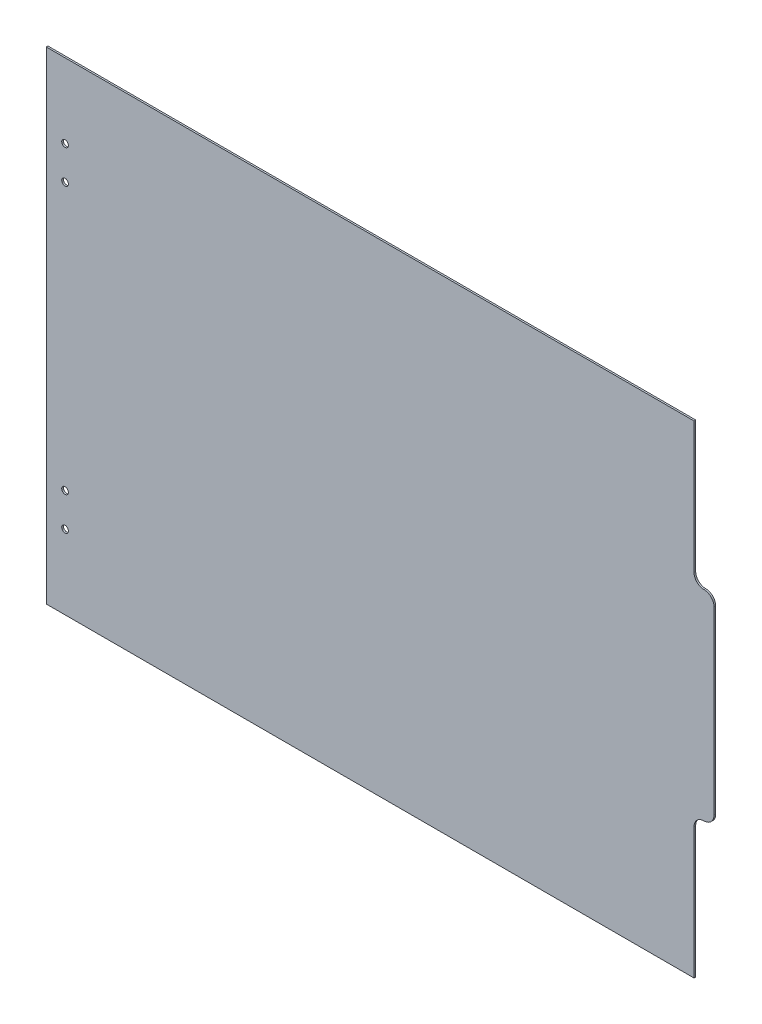
ISO-10303-21;
HEADER;
FILE_DESCRIPTION(('STEP AP214'),'2;1');
FILE_NAME('part.step','',(''),(''),'','','');
FILE_SCHEMA(('AUTOMOTIVE_DESIGN { 1 0 10303 214 1 1 1 1 }'));
ENDSEC;
DATA;
#1=APPLICATION_CONTEXT('core data for automotive mechanical design processes');
#2=APPLICATION_PROTOCOL_DEFINITION('international standard','automotive_design',2000,#1);
#3=PRODUCT_CONTEXT('',#1,'mechanical');
#4=PRODUCT('Part','Part','',(#3));
#5=PRODUCT_RELATED_PRODUCT_CATEGORY('part','',(#4));
#6=PRODUCT_DEFINITION_FORMATION('','',#4);
#7=PRODUCT_DEFINITION_CONTEXT('part definition',#1,'design');
#8=PRODUCT_DEFINITION('design','',#6,#7);
#9=PRODUCT_DEFINITION_SHAPE('','',#8);
#10=(LENGTH_UNIT() NAMED_UNIT(*) SI_UNIT(.MILLI.,.METRE.));
#11=(NAMED_UNIT(*) PLANE_ANGLE_UNIT() SI_UNIT($,.RADIAN.));
#12=(NAMED_UNIT(*) SI_UNIT($,.STERADIAN.) SOLID_ANGLE_UNIT());
#13=UNCERTAINTY_MEASURE_WITH_UNIT(LENGTH_MEASURE(1.E-05),#10,'distance_accuracy_value','');
#14=(GEOMETRIC_REPRESENTATION_CONTEXT(3) GLOBAL_UNCERTAINTY_ASSIGNED_CONTEXT((#13)) GLOBAL_UNIT_ASSIGNED_CONTEXT((#10,
#11,#12)) REPRESENTATION_CONTEXT('',''));
#15=CARTESIAN_POINT('',(0.,0.,0.));
#16=DIRECTION('',(0.,0.,1.));
#17=DIRECTION('',(1.,0.,0.));
#18=AXIS2_PLACEMENT_3D('',#15,#16,#17);
#19=CARTESIAN_POINT('',(194.,-144.5,1.));
#20=DIRECTION('',(-1.,0.,0.));
#21=DIRECTION('',(0.,0.,1.));
#22=AXIS2_PLACEMENT_3D('',#19,#20,#21);
#23=PLANE('',#22);
#24=DIRECTION('',(0.,1.,0.));
#25=VECTOR('',#24,1.);
#26=CARTESIAN_POINT('',(194.,-144.5,1.));
#27=LINE('',#26,#25);
#28=CARTESIAN_POINT('',(194.,66.,1.));
#29=VERTEX_POINT('',#28);
#30=CARTESIAN_POINT('',(194.,144.5,1.));
#31=VERTEX_POINT('',#30);
#32=EDGE_CURVE('E127',#29,#31,#27,.T.);
#33=ORIENTED_EDGE('',*,*,#32,.F.);
#34=DIRECTION('',(0.,0.,1.));
#35=VECTOR('',#34,1.);
#36=CARTESIAN_POINT('',(194.,66.,1.));
#37=LINE('',#36,#35);
#38=CARTESIAN_POINT('',(194.,66.,0.));
#39=VERTEX_POINT('',#38);
#40=EDGE_CURVE('E165',#29,#39,#37,.F.);
#41=ORIENTED_EDGE('',*,*,#40,.T.);
#42=DIRECTION('',(0.,1.,0.));
#43=VECTOR('',#42,1.);
#44=CARTESIAN_POINT('',(194.,-144.5,0.));
#45=LINE('',#44,#43);
#46=CARTESIAN_POINT('',(194.,144.5,0.));
#47=VERTEX_POINT('',#46);
#48=EDGE_CURVE('E196',#39,#47,#45,.T.);
#49=ORIENTED_EDGE('',*,*,#48,.T.);
#50=DIRECTION('',(0.,0.,-1.));
#51=VECTOR('',#50,1.);
#52=CARTESIAN_POINT('',(194.,144.5,1.));
#53=LINE('',#52,#51);
#54=EDGE_CURVE('E148',#31,#47,#53,.T.);
#55=ORIENTED_EDGE('',*,*,#54,.F.);
#56=EDGE_LOOP('',(#33,#41,#49,#55));
#57=FACE_BOUND('',#56,.T.);
#58=ADVANCED_FACE('F39',(#57),#23,.F.);
#59=CARTESIAN_POINT('',(0.,0.,1.));
#60=DIRECTION('',(0.,0.,1.));
#61=DIRECTION('',(1.,0.,0.));
#62=AXIS2_PLACEMENT_3D('',#59,#60,#61);
#63=PLANE('',#62);
#64=CARTESIAN_POINT('',(-182.759742868737,100.000000001524,1.));
#65=DIRECTION('',(0.,0.,1.));
#66=DIRECTION('',(1.,0.,0.));
#67=AXIS2_PLACEMENT_3D('',#64,#65,#66);
#68=CIRCLE('',#67,2.);
#69=CARTESIAN_POINT('',(-180.759742868737,100.000000001524,1.));
#70=VERTEX_POINT('',#69);
#71=EDGE_CURVE('E229',#70,#70,#68,.T.);
#72=ORIENTED_EDGE('',*,*,#71,.F.);
#73=EDGE_LOOP('',(#72));
#74=FACE_BOUND('',#73,.T.);
#75=CARTESIAN_POINT('',(-182.75974286874,-99.9999999999501,1.));
#76=DIRECTION('',(0.,0.,1.));
#77=DIRECTION('',(1.,0.,0.));
#78=AXIS2_PLACEMENT_3D('',#75,#76,#77);
#79=CIRCLE('',#78,1.99999999998629);
#80=CARTESIAN_POINT('',(-180.759742868754,-99.9999999999501,1.));
#81=VERTEX_POINT('',#80);
#82=EDGE_CURVE('E199',#81,#81,#79,.T.);
#83=ORIENTED_EDGE('',*,*,#82,.F.);
#84=EDGE_LOOP('',(#83));
#85=FACE_BOUND('',#84,.T.);
#86=CARTESIAN_POINT('',(194.,-144.5,1.));
#87=VERTEX_POINT('',#86);
#88=CARTESIAN_POINT('',(194.,-66.,1.));
#89=VERTEX_POINT('',#88);
#90=EDGE_CURVE('E188',#87,#89,#27,.T.);
#91=ORIENTED_EDGE('',*,*,#90,.T.);
#92=CARTESIAN_POINT('',(200.,-66.,1.));
#93=DIRECTION('',(0.,0.,1.));
#94=DIRECTION('',(1.,0.,0.));
#95=AXIS2_PLACEMENT_3D('',#92,#93,#94);
#96=CIRCLE('',#95,6.);
#97=CARTESIAN_POINT('',(200.,-60.,1.));
#98=VERTEX_POINT('',#97);
#99=EDGE_CURVE('E168',#89,#98,#96,.F.);
#100=ORIENTED_EDGE('',*,*,#99,.T.);
#101=CARTESIAN_POINT('',(200.,-54.,1.));
#102=DIRECTION('',(0.,0.,1.));
#103=DIRECTION('',(1.,0.,0.));
#104=AXIS2_PLACEMENT_3D('',#101,#102,#103);
#105=CIRCLE('',#104,6.);
#106=CARTESIAN_POINT('',(206.,-54.,1.));
#107=VERTEX_POINT('',#106);
#108=EDGE_CURVE('E151',#98,#107,#105,.T.);
#109=ORIENTED_EDGE('',*,*,#108,.T.);
#110=DIRECTION('',(0.,1.,0.));
#111=VECTOR('',#110,1.);
#112=CARTESIAN_POINT('',(206.,60.,1.));
#113=LINE('',#112,#111);
#114=CARTESIAN_POINT('',(206.,54.,1.));
#115=VERTEX_POINT('',#114);
#116=EDGE_CURVE('E175',#107,#115,#113,.T.);
#117=ORIENTED_EDGE('',*,*,#116,.T.);
#118=CARTESIAN_POINT('',(200.,54.,1.));
#119=DIRECTION('',(0.,0.,1.));
#120=DIRECTION('',(1.,0.,0.));
#121=AXIS2_PLACEMENT_3D('',#118,#119,#120);
#122=CIRCLE('',#121,6.);
#123=CARTESIAN_POINT('',(200.,60.,1.));
#124=VERTEX_POINT('',#123);
#125=EDGE_CURVE('E150',#115,#124,#122,.T.);
#126=ORIENTED_EDGE('',*,*,#125,.T.);
#127=CARTESIAN_POINT('',(200.,66.,1.));
#128=DIRECTION('',(0.,0.,1.));
#129=DIRECTION('',(1.,0.,0.));
#130=AXIS2_PLACEMENT_3D('',#127,#128,#129);
#131=CIRCLE('',#130,6.);
#132=EDGE_CURVE('E48',#124,#29,#131,.F.);
#133=ORIENTED_EDGE('',*,*,#132,.T.);
#134=ORIENTED_EDGE('',*,*,#32,.T.);
#135=DIRECTION('',(-1.,0.,0.));
#136=VECTOR('',#135,1.);
#137=CARTESIAN_POINT('',(194.,144.5,1.));
#138=LINE('',#137,#136);
#139=CARTESIAN_POINT('',(-194.,144.5,1.));
#140=VERTEX_POINT('',#139);
#141=EDGE_CURVE('E133',#31,#140,#138,.T.);
#142=ORIENTED_EDGE('',*,*,#141,.T.);
#143=DIRECTION('',(0.,-1.,0.));
#144=VECTOR('',#143,1.);
#145=CARTESIAN_POINT('',(-194.,-144.5,1.));
#146=LINE('',#145,#144);
#147=CARTESIAN_POINT('',(-194.,-144.5,1.));
#148=VERTEX_POINT('',#147);
#149=EDGE_CURVE('E128',#140,#148,#146,.T.);
#150=ORIENTED_EDGE('',*,*,#149,.T.);
#151=DIRECTION('',(1.,0.,0.));
#152=VECTOR('',#151,1.);
#153=CARTESIAN_POINT('',(194.,-144.5,1.));
#154=LINE('',#153,#152);
#155=EDGE_CURVE('E120',#148,#87,#154,.T.);
#156=ORIENTED_EDGE('',*,*,#155,.T.);
#157=EDGE_LOOP('',(#91,#100,#109,#117,#126,#133,#134,#142,#150,#156));
#158=FACE_BOUND('',#157,.T.);
#159=CARTESIAN_POINT('',(-182.75974286874,-79.9999999999501,1.));
#160=DIRECTION('',(0.,0.,1.));
#161=DIRECTION('',(1.,0.,0.));
#162=AXIS2_PLACEMENT_3D('',#159,#160,#161);
#163=CIRCLE('',#162,1.99999999998629);
#164=CARTESIAN_POINT('',(-180.759742868754,-79.9999999999501,1.));
#165=VERTEX_POINT('',#164);
#166=EDGE_CURVE('E236',#165,#165,#163,.T.);
#167=ORIENTED_EDGE('',*,*,#166,.F.);
#168=EDGE_LOOP('',(#167));
#169=FACE_BOUND('',#168,.T.);
#170=CARTESIAN_POINT('',(-182.759742867929,80.0000000015235,1.));
#171=DIRECTION('',(0.,0.,1.));
#172=DIRECTION('',(1.,0.,0.));
#173=AXIS2_PLACEMENT_3D('',#170,#171,#172);
#174=CIRCLE('',#173,2.);
#175=CARTESIAN_POINT('',(-180.759742867929,80.0000000015235,1.));
#176=VERTEX_POINT('',#175);
#177=EDGE_CURVE('E222',#176,#176,#174,.T.);
#178=ORIENTED_EDGE('',*,*,#177,.F.);
#179=EDGE_LOOP('',(#178));
#180=FACE_BOUND('',#179,.T.);
#181=ADVANCED_FACE('F134',(#74,#85,#158,#169,#180),#63,.T.);
#182=CARTESIAN_POINT('',(0.,0.,0.));
#183=DIRECTION('',(0.,0.,1.));
#184=DIRECTION('',(1.,0.,0.));
#185=AXIS2_PLACEMENT_3D('',#182,#183,#184);
#186=PLANE('',#185);
#187=DIRECTION('',(0.,-1.,0.));
#188=VECTOR('',#187,1.);
#189=CARTESIAN_POINT('',(206.,60.,0.));
#190=LINE('',#189,#188);
#191=CARTESIAN_POINT('',(206.,54.,0.));
#192=VERTEX_POINT('',#191);
#193=CARTESIAN_POINT('',(206.,-54.,0.));
#194=VERTEX_POINT('',#193);
#195=EDGE_CURVE('E176',#192,#194,#190,.T.);
#196=ORIENTED_EDGE('',*,*,#195,.T.);
#197=CARTESIAN_POINT('',(200.,-54.,0.));
#198=DIRECTION('',(0.,0.,1.));
#199=DIRECTION('',(1.,0.,0.));
#200=AXIS2_PLACEMENT_3D('',#197,#198,#199);
#201=CIRCLE('',#200,6.);
#202=CARTESIAN_POINT('',(200.,-60.,0.));
#203=VERTEX_POINT('',#202);
#204=EDGE_CURVE('E57',#194,#203,#201,.F.);
#205=ORIENTED_EDGE('',*,*,#204,.T.);
#206=CARTESIAN_POINT('',(200.,-66.,0.));
#207=DIRECTION('',(0.,0.,1.));
#208=DIRECTION('',(1.,0.,0.));
#209=AXIS2_PLACEMENT_3D('',#206,#207,#208);
#210=CIRCLE('',#209,6.);
#211=CARTESIAN_POINT('',(194.,-66.,0.));
#212=VERTEX_POINT('',#211);
#213=EDGE_CURVE('E166',#203,#212,#210,.T.);
#214=ORIENTED_EDGE('',*,*,#213,.T.);
#215=CARTESIAN_POINT('',(194.,-144.5,0.));
#216=VERTEX_POINT('',#215);
#217=EDGE_CURVE('E198',#216,#212,#45,.T.);
#218=ORIENTED_EDGE('',*,*,#217,.F.);
#219=DIRECTION('',(1.,0.,0.));
#220=VECTOR('',#219,1.);
#221=CARTESIAN_POINT('',(194.,-144.5,0.));
#222=LINE('',#221,#220);
#223=CARTESIAN_POINT('',(-194.,-144.5,0.));
#224=VERTEX_POINT('',#223);
#225=EDGE_CURVE('E197',#224,#216,#222,.T.);
#226=ORIENTED_EDGE('',*,*,#225,.F.);
#227=DIRECTION('',(0.,-1.,0.));
#228=VECTOR('',#227,1.);
#229=CARTESIAN_POINT('',(-194.,-144.5,0.));
#230=LINE('',#229,#228);
#231=CARTESIAN_POINT('',(-194.,144.5,0.));
#232=VERTEX_POINT('',#231);
#233=EDGE_CURVE('E141',#232,#224,#230,.T.);
#234=ORIENTED_EDGE('',*,*,#233,.F.);
#235=DIRECTION('',(-1.,0.,0.));
#236=VECTOR('',#235,1.);
#237=CARTESIAN_POINT('',(194.,144.5,0.));
#238=LINE('',#237,#236);
#239=EDGE_CURVE('E137',#47,#232,#238,.T.);
#240=ORIENTED_EDGE('',*,*,#239,.F.);
#241=ORIENTED_EDGE('',*,*,#48,.F.);
#242=CARTESIAN_POINT('',(200.,66.,0.));
#243=DIRECTION('',(0.,0.,1.));
#244=DIRECTION('',(1.,0.,0.));
#245=AXIS2_PLACEMENT_3D('',#242,#243,#244);
#246=CIRCLE('',#245,6.);
#247=CARTESIAN_POINT('',(200.,60.,0.));
#248=VERTEX_POINT('',#247);
#249=EDGE_CURVE('E11',#39,#248,#246,.T.);
#250=ORIENTED_EDGE('',*,*,#249,.T.);
#251=CARTESIAN_POINT('',(200.,54.,0.));
#252=DIRECTION('',(0.,0.,1.));
#253=DIRECTION('',(1.,0.,0.));
#254=AXIS2_PLACEMENT_3D('',#251,#252,#253);
#255=CIRCLE('',#254,6.);
#256=EDGE_CURVE('E163',#248,#192,#255,.F.);
#257=ORIENTED_EDGE('',*,*,#256,.T.);
#258=EDGE_LOOP('',(#196,#205,#214,#218,#226,#234,#240,#241,#250,#257));
#259=FACE_BOUND('',#258,.T.);
#260=CARTESIAN_POINT('',(-182.75974286874,-99.9999999999501,0.));
#261=DIRECTION('',(0.,0.,1.));
#262=DIRECTION('',(1.,0.,0.));
#263=AXIS2_PLACEMENT_3D('',#260,#261,#262);
#264=CIRCLE('',#263,1.99999999998629);
#265=CARTESIAN_POINT('',(-180.759742868754,-99.9999999999501,0.));
#266=VERTEX_POINT('',#265);
#267=EDGE_CURVE('E237',#266,#266,#264,.T.);
#268=ORIENTED_EDGE('',*,*,#267,.T.);
#269=EDGE_LOOP('',(#268));
#270=FACE_BOUND('',#269,.T.);
#271=CARTESIAN_POINT('',(-182.75974286874,-79.9999999999501,0.));
#272=DIRECTION('',(0.,0.,1.));
#273=DIRECTION('',(1.,0.,0.));
#274=AXIS2_PLACEMENT_3D('',#271,#272,#273);
#275=CIRCLE('',#274,1.99999999998629);
#276=CARTESIAN_POINT('',(-180.759742868754,-79.9999999999501,0.));
#277=VERTEX_POINT('',#276);
#278=EDGE_CURVE('E231',#277,#277,#275,.T.);
#279=ORIENTED_EDGE('',*,*,#278,.T.);
#280=EDGE_LOOP('',(#279));
#281=FACE_BOUND('',#280,.T.);
#282=CARTESIAN_POINT('',(-182.759742868737,100.000000001524,0.));
#283=DIRECTION('',(0.,0.,1.));
#284=DIRECTION('',(1.,0.,0.));
#285=AXIS2_PLACEMENT_3D('',#282,#283,#284);
#286=CIRCLE('',#285,2.);
#287=CARTESIAN_POINT('',(-180.759742868737,100.000000001524,0.));
#288=VERTEX_POINT('',#287);
#289=EDGE_CURVE('E226',#288,#288,#286,.T.);
#290=ORIENTED_EDGE('',*,*,#289,.T.);
#291=EDGE_LOOP('',(#290));
#292=FACE_BOUND('',#291,.T.);
#293=CARTESIAN_POINT('',(-182.759742867929,80.0000000015235,0.));
#294=DIRECTION('',(0.,0.,1.));
#295=DIRECTION('',(1.,0.,0.));
#296=AXIS2_PLACEMENT_3D('',#293,#294,#295);
#297=CIRCLE('',#296,2.);
#298=CARTESIAN_POINT('',(-180.759742867929,80.0000000015235,0.));
#299=VERTEX_POINT('',#298);
#300=EDGE_CURVE('E221',#299,#299,#297,.T.);
#301=ORIENTED_EDGE('',*,*,#300,.T.);
#302=EDGE_LOOP('',(#301));
#303=FACE_BOUND('',#302,.T.);
#304=ADVANCED_FACE('F210',(#259,#270,#281,#292,#303),#186,.F.);
#305=CARTESIAN_POINT('',(-194.,-144.5,1.));
#306=DIRECTION('',(1.,0.,0.));
#307=DIRECTION('',(0.,0.,-1.));
#308=AXIS2_PLACEMENT_3D('',#305,#306,#307);
#309=PLANE('',#308);
#310=ORIENTED_EDGE('',*,*,#233,.T.);
#311=DIRECTION('',(0.,0.,-1.));
#312=VECTOR('',#311,1.);
#313=CARTESIAN_POINT('',(-194.,-144.5,1.));
#314=LINE('',#313,#312);
#315=EDGE_CURVE('E122',#148,#224,#314,.T.);
#316=ORIENTED_EDGE('',*,*,#315,.F.);
#317=ORIENTED_EDGE('',*,*,#149,.F.);
#318=DIRECTION('',(0.,0.,-1.));
#319=VECTOR('',#318,1.);
#320=CARTESIAN_POINT('',(-194.,144.5,1.));
#321=LINE('',#320,#319);
#322=EDGE_CURVE('E193',#140,#232,#321,.T.);
#323=ORIENTED_EDGE('',*,*,#322,.T.);
#324=EDGE_LOOP('',(#310,#316,#317,#323));
#325=FACE_BOUND('',#324,.T.);
#326=ADVANCED_FACE('F142',(#325),#309,.F.);
#327=CARTESIAN_POINT('',(194.,-144.5,1.));
#328=DIRECTION('',(0.,1.,0.));
#329=DIRECTION('',(-1.,0.,0.));
#330=AXIS2_PLACEMENT_3D('',#327,#328,#329);
#331=PLANE('',#330);
#332=ORIENTED_EDGE('',*,*,#225,.T.);
#333=DIRECTION('',(0.,0.,-1.));
#334=VECTOR('',#333,1.);
#335=CARTESIAN_POINT('',(194.,-144.5,1.));
#336=LINE('',#335,#334);
#337=EDGE_CURVE('E121',#87,#216,#336,.T.);
#338=ORIENTED_EDGE('',*,*,#337,.F.);
#339=ORIENTED_EDGE('',*,*,#155,.F.);
#340=ORIENTED_EDGE('',*,*,#315,.T.);
#341=EDGE_LOOP('',(#332,#338,#339,#340));
#342=FACE_BOUND('',#341,.T.);
#343=ADVANCED_FACE('F118',(#342),#331,.F.);
#344=ORIENTED_EDGE('',*,*,#217,.T.);
#345=DIRECTION('',(0.,0.,1.));
#346=VECTOR('',#345,1.);
#347=CARTESIAN_POINT('',(194.,-66.,1.));
#348=LINE('',#347,#346);
#349=EDGE_CURVE('E144',#212,#89,#348,.T.);
#350=ORIENTED_EDGE('',*,*,#349,.T.);
#351=ORIENTED_EDGE('',*,*,#90,.F.);
#352=ORIENTED_EDGE('',*,*,#337,.T.);
#353=EDGE_LOOP('',(#344,#350,#351,#352));
#354=FACE_BOUND('',#353,.T.);
#355=ADVANCED_FACE('F211',(#354),#23,.F.);
#356=CARTESIAN_POINT('',(194.,144.5,1.));
#357=DIRECTION('',(0.,-1.,0.));
#358=DIRECTION('',(1.,0.,0.));
#359=AXIS2_PLACEMENT_3D('',#356,#357,#358);
#360=PLANE('',#359);
#361=ORIENTED_EDGE('',*,*,#239,.T.);
#362=ORIENTED_EDGE('',*,*,#322,.F.);
#363=ORIENTED_EDGE('',*,*,#141,.F.);
#364=ORIENTED_EDGE('',*,*,#54,.T.);
#365=EDGE_LOOP('',(#361,#362,#363,#364));
#366=FACE_BOUND('',#365,.T.);
#367=ADVANCED_FACE('F207',(#366),#360,.F.);
#368=CARTESIAN_POINT('',(-182.75974286874,-99.9999999999501,1.));
#369=DIRECTION('',(0.,0.,-1.));
#370=DIRECTION('',(-1.,0.,0.));
#371=AXIS2_PLACEMENT_3D('',#368,#369,#370);
#372=CYLINDRICAL_SURFACE('',#371,1.99999999998629);
#373=ORIENTED_EDGE('',*,*,#82,.T.);
#374=EDGE_LOOP('',(#373));
#375=FACE_BOUND('',#374,.T.);
#376=ORIENTED_EDGE('',*,*,#267,.F.);
#377=EDGE_LOOP('',(#376));
#378=FACE_BOUND('',#377,.T.);
#379=ADVANCED_FACE('F247',(#375,#378),#372,.F.);
#380=CARTESIAN_POINT('',(-182.75974286874,-79.9999999999501,1.));
#381=DIRECTION('',(0.,0.,-1.));
#382=DIRECTION('',(-1.,0.,0.));
#383=AXIS2_PLACEMENT_3D('',#380,#381,#382);
#384=CYLINDRICAL_SURFACE('',#383,1.99999999998629);
#385=ORIENTED_EDGE('',*,*,#166,.T.);
#386=EDGE_LOOP('',(#385));
#387=FACE_BOUND('',#386,.T.);
#388=ORIENTED_EDGE('',*,*,#278,.F.);
#389=EDGE_LOOP('',(#388));
#390=FACE_BOUND('',#389,.T.);
#391=ADVANCED_FACE('F249',(#387,#390),#384,.F.);
#392=CARTESIAN_POINT('',(-182.759742868737,100.000000001524,1.));
#393=DIRECTION('',(0.,0.,-1.));
#394=DIRECTION('',(-1.,0.,0.));
#395=AXIS2_PLACEMENT_3D('',#392,#393,#394);
#396=CYLINDRICAL_SURFACE('',#395,2.);
#397=ORIENTED_EDGE('',*,*,#71,.T.);
#398=EDGE_LOOP('',(#397));
#399=FACE_BOUND('',#398,.T.);
#400=ORIENTED_EDGE('',*,*,#289,.F.);
#401=EDGE_LOOP('',(#400));
#402=FACE_BOUND('',#401,.T.);
#403=ADVANCED_FACE('F260',(#399,#402),#396,.F.);
#404=CARTESIAN_POINT('',(-182.759742867929,80.0000000015235,1.));
#405=DIRECTION('',(0.,0.,-1.));
#406=DIRECTION('',(-1.,0.,0.));
#407=AXIS2_PLACEMENT_3D('',#404,#405,#406);
#408=CYLINDRICAL_SURFACE('',#407,2.);
#409=ORIENTED_EDGE('',*,*,#177,.T.);
#410=EDGE_LOOP('',(#409));
#411=FACE_BOUND('',#410,.T.);
#412=ORIENTED_EDGE('',*,*,#300,.F.);
#413=EDGE_LOOP('',(#412));
#414=FACE_BOUND('',#413,.T.);
#415=ADVANCED_FACE('F306',(#411,#414),#408,.F.);
#416=CARTESIAN_POINT('',(206.,60.,-120.598507453451));
#417=DIRECTION('',(1.,0.,0.));
#418=DIRECTION('',(0.,0.,-1.));
#419=AXIS2_PLACEMENT_3D('',#416,#417,#418);
#420=PLANE('',#419);
#421=ORIENTED_EDGE('',*,*,#116,.F.);
#422=DIRECTION('',(0.,0.,1.));
#423=VECTOR('',#422,1.);
#424=CARTESIAN_POINT('',(206.,-54.,-120.598507453451));
#425=LINE('',#424,#423);
#426=EDGE_CURVE('E157',#107,#194,#425,.F.);
#427=ORIENTED_EDGE('',*,*,#426,.T.);
#428=ORIENTED_EDGE('',*,*,#195,.F.);
#429=DIRECTION('',(0.,0.,1.));
#430=VECTOR('',#429,1.);
#431=CARTESIAN_POINT('',(206.,54.,-120.598507453451));
#432=LINE('',#431,#430);
#433=EDGE_CURVE('E156',#192,#115,#432,.T.);
#434=ORIENTED_EDGE('',*,*,#433,.T.);
#435=EDGE_LOOP('',(#421,#427,#428,#434));
#436=FACE_BOUND('',#435,.T.);
#437=ADVANCED_FACE('F218',(#436),#420,.T.);
#438=CARTESIAN_POINT('',(200.,-54.,-120.598507453451));
#439=DIRECTION('',(0.,0.,1.));
#440=DIRECTION('',(1.,0.,0.));
#441=AXIS2_PLACEMENT_3D('',#438,#439,#440);
#442=CYLINDRICAL_SURFACE('',#441,6.);
#443=DIRECTION('',(0.,0.,1.));
#444=VECTOR('',#443,1.);
#445=CARTESIAN_POINT('',(200.,-60.,-120.598507453451));
#446=LINE('',#445,#444);
#447=EDGE_CURVE('E167',#203,#98,#446,.T.);
#448=ORIENTED_EDGE('',*,*,#447,.F.);
#449=ORIENTED_EDGE('',*,*,#204,.F.);
#450=ORIENTED_EDGE('',*,*,#426,.F.);
#451=ORIENTED_EDGE('',*,*,#108,.F.);
#452=EDGE_LOOP('',(#448,#449,#450,#451));
#453=FACE_BOUND('',#452,.T.);
#454=ADVANCED_FACE('F219',(#453),#442,.T.);
#455=CARTESIAN_POINT('',(200.,-66.,1.));
#456=DIRECTION('',(0.,0.,1.));
#457=DIRECTION('',(1.,0.,0.));
#458=AXIS2_PLACEMENT_3D('',#455,#456,#457);
#459=CYLINDRICAL_SURFACE('',#458,6.);
#460=ORIENTED_EDGE('',*,*,#213,.F.);
#461=ORIENTED_EDGE('',*,*,#447,.T.);
#462=ORIENTED_EDGE('',*,*,#99,.F.);
#463=ORIENTED_EDGE('',*,*,#349,.F.);
#464=EDGE_LOOP('',(#460,#461,#462,#463));
#465=FACE_BOUND('',#464,.T.);
#466=ADVANCED_FACE('F282',(#465),#459,.F.);
#467=CARTESIAN_POINT('',(200.,66.,-120.598507453451));
#468=DIRECTION('',(0.,0.,1.));
#469=DIRECTION('',(1.,0.,0.));
#470=AXIS2_PLACEMENT_3D('',#467,#468,#469);
#471=CYLINDRICAL_SURFACE('',#470,6.);
#472=DIRECTION('',(0.,0.,1.));
#473=VECTOR('',#472,1.);
#474=CARTESIAN_POINT('',(200.,60.,-120.598507453451));
#475=LINE('',#474,#473);
#476=EDGE_CURVE('E43',#248,#124,#475,.T.);
#477=ORIENTED_EDGE('',*,*,#476,.F.);
#478=ORIENTED_EDGE('',*,*,#249,.F.);
#479=ORIENTED_EDGE('',*,*,#40,.F.);
#480=ORIENTED_EDGE('',*,*,#132,.F.);
#481=EDGE_LOOP('',(#477,#478,#479,#480));
#482=FACE_BOUND('',#481,.T.);
#483=ADVANCED_FACE('F41',(#482),#471,.F.);
#484=CARTESIAN_POINT('',(200.,54.,-120.598507453451));
#485=DIRECTION('',(0.,0.,1.));
#486=DIRECTION('',(1.,0.,0.));
#487=AXIS2_PLACEMENT_3D('',#484,#485,#486);
#488=CYLINDRICAL_SURFACE('',#487,6.);
#489=ORIENTED_EDGE('',*,*,#256,.F.);
#490=ORIENTED_EDGE('',*,*,#476,.T.);
#491=ORIENTED_EDGE('',*,*,#125,.F.);
#492=ORIENTED_EDGE('',*,*,#433,.F.);
#493=EDGE_LOOP('',(#489,#490,#491,#492));
#494=FACE_BOUND('',#493,.T.);
#495=ADVANCED_FACE('F181',(#494),#488,.T.);
#496=CLOSED_SHELL('',(#58,#181,#304,#326,#343,#355,#367,#379,#391,#403,#415,#437,#454,#466,#483,#495));
#497=MANIFOLD_SOLID_BREP('B2',#496);
#498=ADVANCED_BREP_SHAPE_REPRESENTATION('',(#18,#497),#14);
#499=SHAPE_DEFINITION_REPRESENTATION(#9,#498);
ENDSEC;
END-ISO-10303-21;
